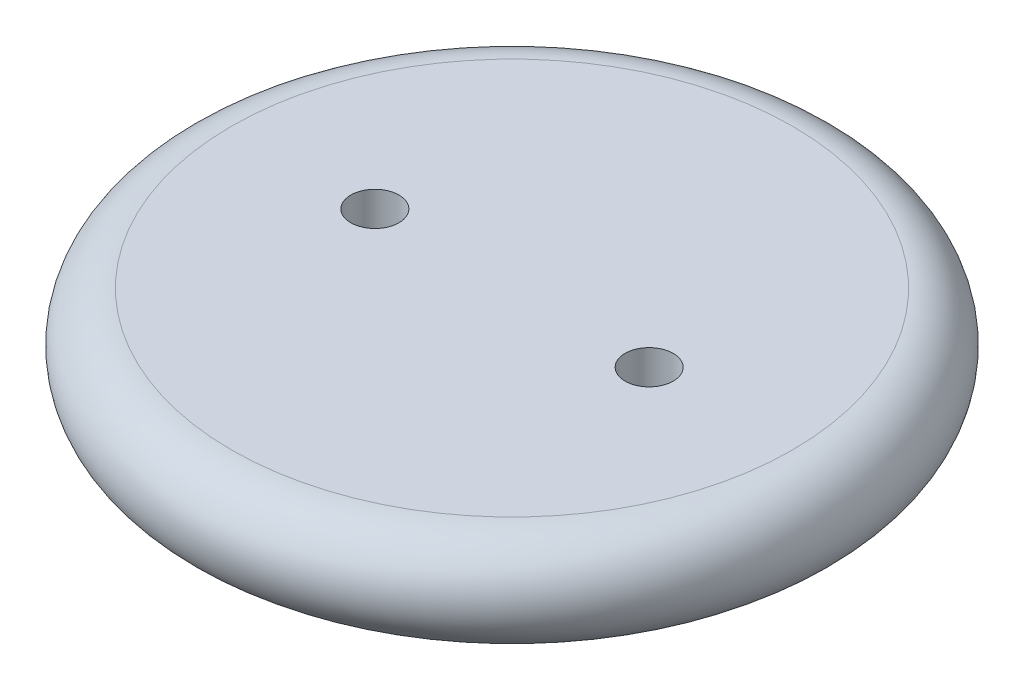
ISO-10303-21;
HEADER;
FILE_DESCRIPTION(('STEP AP214'),'2;1');
FILE_NAME('part.step','',(''),(''),'','','');
FILE_SCHEMA(('AUTOMOTIVE_DESIGN { 1 0 10303 214 1 1 1 1 }'));
ENDSEC;
DATA;
#1=APPLICATION_CONTEXT('core data for automotive mechanical design processes');
#2=APPLICATION_PROTOCOL_DEFINITION('international standard','automotive_design',2000,#1);
#3=PRODUCT_CONTEXT('',#1,'mechanical');
#4=PRODUCT('Part','Part','',(#3));
#5=PRODUCT_RELATED_PRODUCT_CATEGORY('part','',(#4));
#6=PRODUCT_DEFINITION_FORMATION('','',#4);
#7=PRODUCT_DEFINITION_CONTEXT('part definition',#1,'design');
#8=PRODUCT_DEFINITION('design','',#6,#7);
#9=PRODUCT_DEFINITION_SHAPE('','',#8);
#10=(LENGTH_UNIT() NAMED_UNIT(*) SI_UNIT(.MILLI.,.METRE.));
#11=(NAMED_UNIT(*) PLANE_ANGLE_UNIT() SI_UNIT($,.RADIAN.));
#12=(NAMED_UNIT(*) SI_UNIT($,.STERADIAN.) SOLID_ANGLE_UNIT());
#13=UNCERTAINTY_MEASURE_WITH_UNIT(LENGTH_MEASURE(1.E-05),#10,'distance_accuracy_value','');
#14=(GEOMETRIC_REPRESENTATION_CONTEXT(3) GLOBAL_UNCERTAINTY_ASSIGNED_CONTEXT((#13)) GLOBAL_UNIT_ASSIGNED_CONTEXT((#10,
#11,#12)) REPRESENTATION_CONTEXT('',''));
#15=CARTESIAN_POINT('',(0.,0.,0.));
#16=DIRECTION('',(0.,0.,1.));
#17=DIRECTION('',(1.,0.,0.));
#18=AXIS2_PLACEMENT_3D('',#15,#16,#17);
#19=CARTESIAN_POINT('',(-22.25,0.,1.55257751099924E-13));
#20=DIRECTION('',(0.,-1.,0.));
#21=DIRECTION('',(0.,0.,-1.));
#22=AXIS2_PLACEMENT_3D('',#19,#20,#21);
#23=CONICAL_SURFACE('',#22,4.40499999996307,0.785398163340605);
#24=CARTESIAN_POINT('',(-22.25,0.,1.55257751099924E-13));
#25=DIRECTION('',(0.,-1.,0.));
#26=DIRECTION('',(0.,0.,-1.));
#27=AXIS2_PLACEMENT_3D('',#24,#25,#26);
#28=CIRCLE('',#27,4.40499999996307);
#29=CARTESIAN_POINT('',(-22.25,0.,-4.40499999996291));
#30=VERTEX_POINT('',#29);
#31=EDGE_CURVE('E121',#30,#30,#28,.F.);
#32=ORIENTED_EDGE('',*,*,#31,.F.);
#33=EDGE_LOOP('',(#32));
#34=FACE_BOUND('',#33,.T.);
#35=CARTESIAN_POINT('',(-22.25,0.499999999999992,1.55370919578519E-13));
#36=DIRECTION('',(0.,-1.,0.));
#37=DIRECTION('',(0.,0.,-1.));
#38=AXIS2_PLACEMENT_3D('',#35,#36,#37);
#39=CIRCLE('',#38,3.905);
#40=CARTESIAN_POINT('',(-22.25,0.499999999999992,-3.90499999999984));
#41=VERTEX_POINT('',#40);
#42=EDGE_CURVE('E116',#41,#41,#39,.F.);
#43=ORIENTED_EDGE('',*,*,#42,.T.);
#44=EDGE_LOOP('',(#43));
#45=FACE_BOUND('',#44,.T.);
#46=ADVANCED_FACE('F17',(#34,#45),#23,.F.);
#47=CARTESIAN_POINT('',(22.25,0.,0.));
#48=DIRECTION('',(0.,-1.,0.));
#49=DIRECTION('',(0.,0.,-1.));
#50=AXIS2_PLACEMENT_3D('',#47,#48,#49);
#51=CONICAL_SURFACE('',#50,4.40499999996291,0.785398163340605);
#52=CARTESIAN_POINT('',(22.25,0.,0.));
#53=DIRECTION('',(0.,-1.,0.));
#54=DIRECTION('',(0.,0.,-1.));
#55=AXIS2_PLACEMENT_3D('',#52,#53,#54);
#56=CIRCLE('',#55,4.40499999996291);
#57=CARTESIAN_POINT('',(22.25,0.,-4.40499999996291));
#58=VERTEX_POINT('',#57);
#59=EDGE_CURVE('E118',#58,#58,#56,.F.);
#60=ORIENTED_EDGE('',*,*,#59,.F.);
#61=EDGE_LOOP('',(#60));
#62=FACE_BOUND('',#61,.T.);
#63=CARTESIAN_POINT('',(22.25,0.499999999999992,0.));
#64=DIRECTION('',(0.,-1.,0.));
#65=DIRECTION('',(0.,0.,-1.));
#66=AXIS2_PLACEMENT_3D('',#63,#64,#65);
#67=CIRCLE('',#66,3.905);
#68=CARTESIAN_POINT('',(22.25,0.499999999999992,-3.905));
#69=VERTEX_POINT('',#68);
#70=EDGE_CURVE('E51',#69,#69,#67,.F.);
#71=ORIENTED_EDGE('',*,*,#70,.T.);
#72=EDGE_LOOP('',(#71));
#73=FACE_BOUND('',#72,.T.);
#74=ADVANCED_FACE('F136',(#62,#73),#51,.F.);
#75=CARTESIAN_POINT('',(0.,0.,0.));
#76=DIRECTION('',(0.,-1.,0.));
#77=DIRECTION('',(0.,0.,-1.));
#78=AXIS2_PLACEMENT_3D('',#75,#76,#77);
#79=PLANE('',#78);
#80=CARTESIAN_POINT('',(0.,0.,0.));
#81=DIRECTION('',(0.,1.,0.));
#82=DIRECTION('',(0.,0.,1.));
#83=AXIS2_PLACEMENT_3D('',#80,#81,#82);
#84=CIRCLE('',#83,45.5);
#85=CARTESIAN_POINT('',(0.,0.,45.5));
#86=VERTEX_POINT('',#85);
#87=CARTESIAN_POINT('',(0.,0.,-45.5));
#88=VERTEX_POINT('',#87);
#89=EDGE_CURVE('E42',#86,#88,#84,.T.);
#90=ORIENTED_EDGE('',*,*,#89,.F.);
#91=CARTESIAN_POINT('',(0.,0.,0.));
#92=DIRECTION('',(0.,1.,0.));
#93=DIRECTION('',(0.,0.,-1.));
#94=AXIS2_PLACEMENT_3D('',#91,#92,#93);
#95=CIRCLE('',#94,45.5);
#96=EDGE_CURVE('E49',#88,#86,#95,.T.);
#97=ORIENTED_EDGE('',*,*,#96,.F.);
#98=EDGE_LOOP('',(#90,#97));
#99=FACE_BOUND('',#98,.T.);
#100=ORIENTED_EDGE('',*,*,#59,.T.);
#101=EDGE_LOOP('',(#100));
#102=FACE_BOUND('',#101,.T.);
#103=ORIENTED_EDGE('',*,*,#31,.T.);
#104=EDGE_LOOP('',(#103));
#105=FACE_BOUND('',#104,.T.);
#106=ADVANCED_FACE('F47',(#99,#102,#105),#79,.T.);
#107=CARTESIAN_POINT('',(-22.25,16.,1.55370919578519E-13));
#108=DIRECTION('',(0.,-1.,0.));
#109=DIRECTION('',(0.,0.,-1.));
#110=AXIS2_PLACEMENT_3D('',#107,#108,#109);
#111=CYLINDRICAL_SURFACE('',#110,3.905);
#112=ORIENTED_EDGE('',*,*,#42,.F.);
#113=EDGE_LOOP('',(#112));
#114=FACE_BOUND('',#113,.T.);
#115=CARTESIAN_POINT('',(-22.25,16.,1.55370919578519E-13));
#116=DIRECTION('',(0.,-1.,0.));
#117=DIRECTION('',(0.,0.,-1.));
#118=AXIS2_PLACEMENT_3D('',#115,#116,#117);
#119=CIRCLE('',#118,3.905);
#120=CARTESIAN_POINT('',(-22.25,16.,-3.90499999999984));
#121=VERTEX_POINT('',#120);
#122=EDGE_CURVE('E56',#121,#121,#119,.T.);
#123=ORIENTED_EDGE('',*,*,#122,.F.);
#124=EDGE_LOOP('',(#123));
#125=FACE_BOUND('',#124,.T.);
#126=ADVANCED_FACE('F146',(#114,#125),#111,.F.);
#127=CARTESIAN_POINT('',(22.25,16.,0.));
#128=DIRECTION('',(0.,-1.,0.));
#129=DIRECTION('',(0.,0.,-1.));
#130=AXIS2_PLACEMENT_3D('',#127,#128,#129);
#131=CYLINDRICAL_SURFACE('',#130,3.905);
#132=ORIENTED_EDGE('',*,*,#70,.F.);
#133=EDGE_LOOP('',(#132));
#134=FACE_BOUND('',#133,.T.);
#135=CARTESIAN_POINT('',(22.25,16.,0.));
#136=DIRECTION('',(0.,-1.,0.));
#137=DIRECTION('',(0.,0.,-1.));
#138=AXIS2_PLACEMENT_3D('',#135,#136,#137);
#139=CIRCLE('',#138,3.905);
#140=CARTESIAN_POINT('',(22.25,16.,-3.905));
#141=VERTEX_POINT('',#140);
#142=EDGE_CURVE('E110',#141,#141,#139,.T.);
#143=ORIENTED_EDGE('',*,*,#142,.F.);
#144=EDGE_LOOP('',(#143));
#145=FACE_BOUND('',#144,.T.);
#146=ADVANCED_FACE('F77',(#134,#145),#131,.F.);
#147=CARTESIAN_POINT('',(0.,8.,0.));
#148=DIRECTION('',(0.,-1.,0.));
#149=DIRECTION('',(0.,0.,-1.));
#150=AXIS2_PLACEMENT_3D('',#147,#148,#149);
#151=TOROIDAL_SURFACE('',#150,45.5,8.);
#152=CARTESIAN_POINT('',(0.,16.,0.));
#153=DIRECTION('',(0.,-1.,0.));
#154=DIRECTION('',(0.,0.,-1.));
#155=AXIS2_PLACEMENT_3D('',#152,#153,#154);
#156=CIRCLE('',#155,45.5);
#157=CARTESIAN_POINT('',(0.,16.,45.5));
#158=VERTEX_POINT('',#157);
#159=CARTESIAN_POINT('',(0.,16.,-45.5));
#160=VERTEX_POINT('',#159);
#161=EDGE_CURVE('E28',#158,#160,#156,.F.);
#162=ORIENTED_EDGE('',*,*,#161,.F.);
#163=CARTESIAN_POINT('',(0.,16.,0.));
#164=DIRECTION('',(0.,-1.,0.));
#165=DIRECTION('',(0.,0.,1.));
#166=AXIS2_PLACEMENT_3D('',#163,#164,#165);
#167=CIRCLE('',#166,45.5);
#168=EDGE_CURVE('E11',#160,#158,#167,.F.);
#169=ORIENTED_EDGE('',*,*,#168,.F.);
#170=EDGE_LOOP('',(#162,#169));
#171=FACE_BOUND('',#170,.T.);
#172=ORIENTED_EDGE('',*,*,#96,.T.);
#173=ORIENTED_EDGE('',*,*,#89,.T.);
#174=EDGE_LOOP('',(#172,#173));
#175=FACE_BOUND('',#174,.T.);
#176=ADVANCED_FACE('F55',(#171,#175),#151,.T.);
#177=CARTESIAN_POINT('',(0.,16.,0.));
#178=DIRECTION('',(0.,1.,0.));
#179=DIRECTION('',(0.,0.,1.));
#180=AXIS2_PLACEMENT_3D('',#177,#178,#179);
#181=PLANE('',#180);
#182=ORIENTED_EDGE('',*,*,#161,.T.);
#183=ORIENTED_EDGE('',*,*,#168,.T.);
#184=EDGE_LOOP('',(#182,#183));
#185=FACE_BOUND('',#184,.T.);
#186=ORIENTED_EDGE('',*,*,#142,.T.);
#187=EDGE_LOOP('',(#186));
#188=FACE_BOUND('',#187,.T.);
#189=ORIENTED_EDGE('',*,*,#122,.T.);
#190=EDGE_LOOP('',(#189));
#191=FACE_BOUND('',#190,.T.);
#192=ADVANCED_FACE('F76',(#185,#188,#191),#181,.T.);
#193=CLOSED_SHELL('',(#46,#74,#106,#126,#146,#176,#192));
#194=MANIFOLD_SOLID_BREP('B1',#193);
#195=ADVANCED_BREP_SHAPE_REPRESENTATION('',(#18,#194),#14);
#196=SHAPE_DEFINITION_REPRESENTATION(#9,#195);
ENDSEC;
END-ISO-10303-21;
